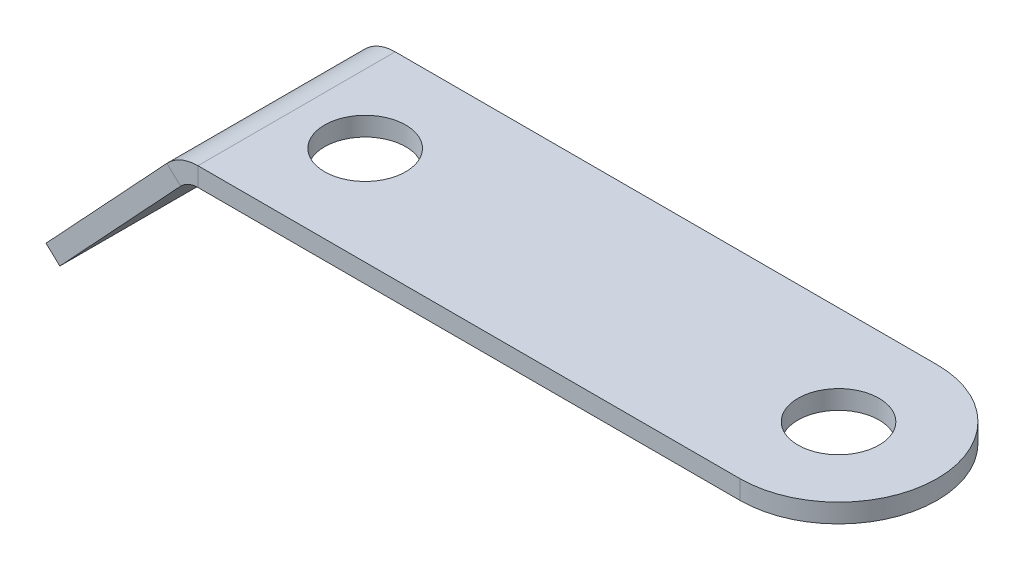
ISO-10303-21;
HEADER;
FILE_DESCRIPTION(('STEP AP214'),'2;1');
FILE_NAME('part.step','',(''),(''),'','','');
FILE_SCHEMA(('AUTOMOTIVE_DESIGN { 1 0 10303 214 1 1 1 1 }'));
ENDSEC;
DATA;
#1=APPLICATION_CONTEXT('core data for automotive mechanical design processes');
#2=APPLICATION_PROTOCOL_DEFINITION('international standard','automotive_design',2000,#1);
#3=PRODUCT_CONTEXT('',#1,'mechanical');
#4=PRODUCT('Part','Part','',(#3));
#5=PRODUCT_RELATED_PRODUCT_CATEGORY('part','',(#4));
#6=PRODUCT_DEFINITION_FORMATION('','',#4);
#7=PRODUCT_DEFINITION_CONTEXT('part definition',#1,'design');
#8=PRODUCT_DEFINITION('design','',#6,#7);
#9=PRODUCT_DEFINITION_SHAPE('','',#8);
#10=(LENGTH_UNIT() NAMED_UNIT(*) SI_UNIT(.MILLI.,.METRE.));
#11=(NAMED_UNIT(*) PLANE_ANGLE_UNIT() SI_UNIT($,.RADIAN.));
#12=(NAMED_UNIT(*) SI_UNIT($,.STERADIAN.) SOLID_ANGLE_UNIT());
#13=UNCERTAINTY_MEASURE_WITH_UNIT(LENGTH_MEASURE(1.E-05),#10,'distance_accuracy_value','');
#14=(GEOMETRIC_REPRESENTATION_CONTEXT(3) GLOBAL_UNCERTAINTY_ASSIGNED_CONTEXT((#13)) GLOBAL_UNIT_ASSIGNED_CONTEXT((#10,
#11,#12)) REPRESENTATION_CONTEXT('',''));
#15=CARTESIAN_POINT('',(0.,0.,0.));
#16=DIRECTION('',(0.,0.,1.));
#17=DIRECTION('',(1.,0.,0.));
#18=AXIS2_PLACEMENT_3D('',#15,#16,#17);
#19=CARTESIAN_POINT('',(0.,-1.51892,-15.875));
#20=DIRECTION('',(0.,0.,-1.));
#21=DIRECTION('',(-1.,0.,0.));
#22=AXIS2_PLACEMENT_3D('',#19,#20,#21);
#23=PLANE('',#22);
#24=DIRECTION('',(-1.,0.,0.));
#25=VECTOR('',#24,1.);
#26=CARTESIAN_POINT('',(0.,-1.51892,-15.875));
#27=LINE('',#26,#25);
#28=CARTESIAN_POINT('',(44.45,-1.51892,-15.875));
#29=VERTEX_POINT('',#28);
#30=CARTESIAN_POINT('',(0.828317574300574,-1.51892,-15.875));
#31=VERTEX_POINT('',#30);
#32=EDGE_CURVE('E190',#29,#31,#27,.T.);
#33=ORIENTED_EDGE('',*,*,#32,.T.);
#34=DIRECTION('',(0.,1.,0.));
#35=VECTOR('',#34,1.);
#36=CARTESIAN_POINT('',(0.828317574300573,-1.51892,-15.875));
#37=LINE('',#36,#35);
#38=CARTESIAN_POINT('',(0.828317574300573,0.,-15.875));
#39=VERTEX_POINT('',#38);
#40=EDGE_CURVE('E163',#31,#39,#37,.T.);
#41=ORIENTED_EDGE('',*,*,#40,.T.);
#42=DIRECTION('',(-1.,0.,0.));
#43=VECTOR('',#42,1.);
#44=CARTESIAN_POINT('',(0.,0.,-15.875));
#45=LINE('',#44,#43);
#46=CARTESIAN_POINT('',(44.45,0.,-15.875));
#47=VERTEX_POINT('',#46);
#48=EDGE_CURVE('E187',#47,#39,#45,.T.);
#49=ORIENTED_EDGE('',*,*,#48,.F.);
#50=DIRECTION('',(0.,1.,0.));
#51=VECTOR('',#50,1.);
#52=CARTESIAN_POINT('',(44.45,-1.51892,-15.875));
#53=LINE('',#52,#51);
#54=EDGE_CURVE('E11',#29,#47,#53,.T.);
#55=ORIENTED_EDGE('',*,*,#54,.F.);
#56=EDGE_LOOP('',(#33,#41,#49,#55));
#57=FACE_BOUND('',#56,.T.);
#58=ADVANCED_FACE('F43',(#57),#23,.T.);
#59=CARTESIAN_POINT('',(44.45,-1.51892,-7.9375));
#60=DIRECTION('',(0.,-1.,0.));
#61=DIRECTION('',(0.,0.,-1.));
#62=AXIS2_PLACEMENT_3D('',#59,#60,#61);
#63=PLANE('',#62);
#64=CARTESIAN_POINT('',(6.34999999999999,-1.51892,-7.9375));
#65=DIRECTION('',(0.,1.,0.));
#66=DIRECTION('',(0.,0.,1.));
#67=AXIS2_PLACEMENT_3D('',#64,#65,#66);
#68=CIRCLE('',#67,3.2639);
#69=CARTESIAN_POINT('',(6.34999999999999,-1.51892,-4.6736));
#70=VERTEX_POINT('',#69);
#71=EDGE_CURVE('E172',#70,#70,#68,.T.);
#72=ORIENTED_EDGE('',*,*,#71,.T.);
#73=EDGE_LOOP('',(#72));
#74=FACE_BOUND('',#73,.T.);
#75=CARTESIAN_POINT('',(44.45,-1.51892,-7.9375));
#76=DIRECTION('',(0.,1.,0.));
#77=DIRECTION('',(0.,0.,1.));
#78=AXIS2_PLACEMENT_3D('',#75,#76,#77);
#79=CIRCLE('',#78,3.2639);
#80=CARTESIAN_POINT('',(44.45,-1.51892,-4.6736));
#81=VERTEX_POINT('',#80);
#82=EDGE_CURVE('E178',#81,#81,#79,.T.);
#83=ORIENTED_EDGE('',*,*,#82,.T.);
#84=EDGE_LOOP('',(#83));
#85=FACE_BOUND('',#84,.T.);
#86=DIRECTION('',(1.,0.,0.));
#87=VECTOR('',#86,1.);
#88=CARTESIAN_POINT('',(0.,-1.51892,0.));
#89=LINE('',#88,#87);
#90=CARTESIAN_POINT('',(0.828317574300574,-1.51892,0.));
#91=VERTEX_POINT('',#90);
#92=CARTESIAN_POINT('',(44.45,-1.51892,0.));
#93=VERTEX_POINT('',#92);
#94=EDGE_CURVE('E184',#91,#93,#89,.T.);
#95=ORIENTED_EDGE('',*,*,#94,.F.);
#96=DIRECTION('',(0.,0.,-1.));
#97=VECTOR('',#96,1.);
#98=CARTESIAN_POINT('',(0.828317574300573,-1.51892,-15.875));
#99=LINE('',#98,#97);
#100=EDGE_CURVE('E65',#31,#91,#99,.F.);
#101=ORIENTED_EDGE('',*,*,#100,.F.);
#102=ORIENTED_EDGE('',*,*,#32,.F.);
#103=CARTESIAN_POINT('',(44.45,-1.51892,-7.9375));
#104=DIRECTION('',(0.,1.,0.));
#105=DIRECTION('',(0.,0.,-1.));
#106=AXIS2_PLACEMENT_3D('',#103,#104,#105);
#107=CIRCLE('',#106,7.9375);
#108=EDGE_CURVE('E186',#93,#29,#107,.T.);
#109=ORIENTED_EDGE('',*,*,#108,.F.);
#110=EDGE_LOOP('',(#95,#101,#102,#109));
#111=FACE_BOUND('',#110,.T.);
#112=ADVANCED_FACE('F229',(#74,#85,#111),#63,.T.);
#113=CARTESIAN_POINT('',(44.45,0.,-7.9375));
#114=DIRECTION('',(0.,-1.,0.));
#115=DIRECTION('',(0.,0.,-1.));
#116=AXIS2_PLACEMENT_3D('',#113,#114,#115);
#117=PLANE('',#116);
#118=CARTESIAN_POINT('',(44.45,0.,-7.9375));
#119=DIRECTION('',(0.,1.,0.));
#120=DIRECTION('',(0.,0.,1.));
#121=AXIS2_PLACEMENT_3D('',#118,#119,#120);
#122=CIRCLE('',#121,3.2639);
#123=CARTESIAN_POINT('',(44.45,0.,-4.6736));
#124=VERTEX_POINT('',#123);
#125=EDGE_CURVE('E175',#124,#124,#122,.T.);
#126=ORIENTED_EDGE('',*,*,#125,.F.);
#127=EDGE_LOOP('',(#126));
#128=FACE_BOUND('',#127,.T.);
#129=CARTESIAN_POINT('',(6.34999999999999,0.,-7.9375));
#130=DIRECTION('',(0.,1.,0.));
#131=DIRECTION('',(0.,0.,1.));
#132=AXIS2_PLACEMENT_3D('',#129,#130,#131);
#133=CIRCLE('',#132,3.2639);
#134=CARTESIAN_POINT('',(6.34999999999999,0.,-4.6736));
#135=VERTEX_POINT('',#134);
#136=EDGE_CURVE('E170',#135,#135,#133,.T.);
#137=ORIENTED_EDGE('',*,*,#136,.F.);
#138=EDGE_LOOP('',(#137));
#139=FACE_BOUND('',#138,.T.);
#140=DIRECTION('',(0.,0.,-1.));
#141=VECTOR('',#140,1.);
#142=CARTESIAN_POINT('',(0.828317574300573,0.,-15.875));
#143=LINE('',#142,#141);
#144=CARTESIAN_POINT('',(0.828317574300574,0.,0.));
#145=VERTEX_POINT('',#144);
#146=EDGE_CURVE('E116',#39,#145,#143,.F.);
#147=ORIENTED_EDGE('',*,*,#146,.T.);
#148=DIRECTION('',(1.,0.,0.));
#149=VECTOR('',#148,1.);
#150=CARTESIAN_POINT('',(0.,0.,0.));
#151=LINE('',#150,#149);
#152=CARTESIAN_POINT('',(44.45,0.,0.));
#153=VERTEX_POINT('',#152);
#154=EDGE_CURVE('E181',#145,#153,#151,.T.);
#155=ORIENTED_EDGE('',*,*,#154,.T.);
#156=CARTESIAN_POINT('',(44.45,0.,-7.9375));
#157=DIRECTION('',(0.,1.,0.));
#158=DIRECTION('',(0.,0.,-1.));
#159=AXIS2_PLACEMENT_3D('',#156,#157,#158);
#160=CIRCLE('',#159,7.9375);
#161=EDGE_CURVE('E193',#153,#47,#160,.T.);
#162=ORIENTED_EDGE('',*,*,#161,.T.);
#163=ORIENTED_EDGE('',*,*,#48,.T.);
#164=EDGE_LOOP('',(#147,#155,#162,#163));
#165=FACE_BOUND('',#164,.T.);
#166=ADVANCED_FACE('F199',(#128,#139,#165),#117,.F.);
#167=CARTESIAN_POINT('',(44.45,-1.51892,-7.9375));
#168=DIRECTION('',(0.,1.,0.));
#169=DIRECTION('',(0.,0.,1.));
#170=AXIS2_PLACEMENT_3D('',#167,#168,#169);
#171=CYLINDRICAL_SURFACE('',#170,7.9375);
#172=ORIENTED_EDGE('',*,*,#161,.F.);
#173=DIRECTION('',(0.,1.,0.));
#174=VECTOR('',#173,1.);
#175=CARTESIAN_POINT('',(44.45,-1.51892,0.));
#176=LINE('',#175,#174);
#177=EDGE_CURVE('E47',#93,#153,#176,.T.);
#178=ORIENTED_EDGE('',*,*,#177,.F.);
#179=ORIENTED_EDGE('',*,*,#108,.T.);
#180=ORIENTED_EDGE('',*,*,#54,.T.);
#181=EDGE_LOOP('',(#172,#178,#179,#180));
#182=FACE_BOUND('',#181,.T.);
#183=ADVANCED_FACE('F237',(#182),#171,.T.);
#184=CARTESIAN_POINT('',(0.,-1.51892,0.));
#185=DIRECTION('',(0.,0.,1.));
#186=DIRECTION('',(1.,0.,0.));
#187=AXIS2_PLACEMENT_3D('',#184,#185,#186);
#188=PLANE('',#187);
#189=DIRECTION('',(0.,1.,0.));
#190=VECTOR('',#189,1.);
#191=CARTESIAN_POINT('',(0.828317574300573,-1.51892,0.));
#192=LINE('',#191,#190);
#193=EDGE_CURVE('E58',#91,#145,#192,.T.);
#194=ORIENTED_EDGE('',*,*,#193,.F.);
#195=ORIENTED_EDGE('',*,*,#94,.T.);
#196=ORIENTED_EDGE('',*,*,#177,.T.);
#197=ORIENTED_EDGE('',*,*,#154,.F.);
#198=EDGE_LOOP('',(#194,#195,#196,#197));
#199=FACE_BOUND('',#198,.T.);
#200=ADVANCED_FACE('F45',(#199),#188,.T.);
#201=CARTESIAN_POINT('',(44.45,-1.51892,-7.9375));
#202=DIRECTION('',(0.,1.,0.));
#203=DIRECTION('',(0.,0.,1.));
#204=AXIS2_PLACEMENT_3D('',#201,#202,#203);
#205=CYLINDRICAL_SURFACE('',#204,3.2639);
#206=ORIENTED_EDGE('',*,*,#82,.F.);
#207=EDGE_LOOP('',(#206));
#208=FACE_BOUND('',#207,.T.);
#209=ORIENTED_EDGE('',*,*,#125,.T.);
#210=EDGE_LOOP('',(#209));
#211=FACE_BOUND('',#210,.T.);
#212=ADVANCED_FACE('F224',(#208,#211),#205,.F.);
#213=CARTESIAN_POINT('',(6.34999999999999,-1.51892,-7.9375));
#214=DIRECTION('',(0.,1.,0.));
#215=DIRECTION('',(0.,0.,1.));
#216=AXIS2_PLACEMENT_3D('',#213,#214,#215);
#217=CYLINDRICAL_SURFACE('',#216,3.2639);
#218=ORIENTED_EDGE('',*,*,#71,.F.);
#219=EDGE_LOOP('',(#218));
#220=FACE_BOUND('',#219,.T.);
#221=ORIENTED_EDGE('',*,*,#136,.T.);
#222=EDGE_LOOP('',(#221));
#223=FACE_BOUND('',#222,.T.);
#224=ADVANCED_FACE('F216',(#220,#223),#217,.F.);
#225=CARTESIAN_POINT('',(0.828317574300573,-3.42392,0.));
#226=DIRECTION('',(0.,0.,1.));
#227=DIRECTION('',(1.,0.,0.));
#228=AXIS2_PLACEMENT_3D('',#225,#226,#227);
#229=PLANE('',#228);
#230=DIRECTION('',(-0.731353701619167,0.681998360062502,0.));
#231=VECTOR('',#230,1.);
#232=CARTESIAN_POINT('',(-0.56491122728394,-2.12471312408093,0.));
#233=LINE('',#232,#231);
#234=CARTESIAN_POINT('',(-0.564911227283941,-2.12471312408093,0.));
#235=VERTEX_POINT('',#234);
#236=CARTESIAN_POINT('',(-1.67577899174733,-1.0888121750148,0.));
#237=VERTEX_POINT('',#236);
#238=EDGE_CURVE('E208',#235,#237,#233,.T.);
#239=ORIENTED_EDGE('',*,*,#238,.F.);
#240=CARTESIAN_POINT('',(0.828317574300573,-3.42392,0.));
#241=DIRECTION('',(0.,0.,-1.));
#242=DIRECTION('',(-1.,0.,0.));
#243=AXIS2_PLACEMENT_3D('',#240,#241,#242);
#244=CIRCLE('',#243,1.905);
#245=EDGE_CURVE('E119',#91,#235,#244,.F.);
#246=ORIENTED_EDGE('',*,*,#245,.F.);
#247=ORIENTED_EDGE('',*,*,#193,.T.);
#248=CARTESIAN_POINT('',(0.828317574300573,-3.42392,0.));
#249=DIRECTION('',(0.,0.,-1.));
#250=DIRECTION('',(-1.,0.,0.));
#251=AXIS2_PLACEMENT_3D('',#248,#249,#250);
#252=CIRCLE('',#251,3.42392);
#253=EDGE_CURVE('E162',#145,#237,#252,.F.);
#254=ORIENTED_EDGE('',*,*,#253,.T.);
#255=EDGE_LOOP('',(#239,#246,#247,#254));
#256=FACE_BOUND('',#255,.T.);
#257=ADVANCED_FACE('F214',(#256),#229,.T.);
#258=CARTESIAN_POINT('',(0.828317574300573,-3.42392,-15.875));
#259=DIRECTION('',(0.,0.,1.));
#260=DIRECTION('',(1.,0.,0.));
#261=AXIS2_PLACEMENT_3D('',#258,#259,#260);
#262=PLANE('',#261);
#263=CARTESIAN_POINT('',(0.828317574300573,-3.42392,-15.875));
#264=DIRECTION('',(0.,0.,-1.));
#265=DIRECTION('',(-1.,0.,0.));
#266=AXIS2_PLACEMENT_3D('',#263,#264,#265);
#267=CIRCLE('',#266,1.905);
#268=CARTESIAN_POINT('',(-0.564911227283941,-2.12471312408093,-15.875));
#269=VERTEX_POINT('',#268);
#270=EDGE_CURVE('E126',#269,#31,#267,.T.);
#271=ORIENTED_EDGE('',*,*,#270,.F.);
#272=DIRECTION('',(-0.731353701619167,0.681998360062502,0.));
#273=VECTOR('',#272,1.);
#274=CARTESIAN_POINT('',(-0.56491122728394,-2.12471312408093,-15.875));
#275=LINE('',#274,#273);
#276=CARTESIAN_POINT('',(-1.67577899174733,-1.0888121750148,-15.875));
#277=VERTEX_POINT('',#276);
#278=EDGE_CURVE('E123',#269,#277,#275,.T.);
#279=ORIENTED_EDGE('',*,*,#278,.T.);
#280=CARTESIAN_POINT('',(0.828317574300573,-3.42392,-15.875));
#281=DIRECTION('',(0.,0.,-1.));
#282=DIRECTION('',(-1.,0.,0.));
#283=AXIS2_PLACEMENT_3D('',#280,#281,#282);
#284=CIRCLE('',#283,3.42392);
#285=EDGE_CURVE('E109',#277,#39,#284,.T.);
#286=ORIENTED_EDGE('',*,*,#285,.T.);
#287=ORIENTED_EDGE('',*,*,#40,.F.);
#288=EDGE_LOOP('',(#271,#279,#286,#287));
#289=FACE_BOUND('',#288,.T.);
#290=ADVANCED_FACE('F124',(#289),#262,.F.);
#291=CARTESIAN_POINT('',(0.828317574300573,-3.42392,-15.875));
#292=DIRECTION('',(0.,0.,-1.));
#293=DIRECTION('',(-0.731353701619167,0.681998360062502,0.));
#294=AXIS2_PLACEMENT_3D('',#291,#292,#293);
#295=CYLINDRICAL_SURFACE('',#294,3.42392);
#296=ORIENTED_EDGE('',*,*,#146,.F.);
#297=ORIENTED_EDGE('',*,*,#285,.F.);
#298=DIRECTION('',(0.,0.,1.));
#299=VECTOR('',#298,1.);
#300=CARTESIAN_POINT('',(-1.67577899174733,-1.0888121750148,0.));
#301=LINE('',#300,#299);
#302=EDGE_CURVE('E114',#277,#237,#301,.T.);
#303=ORIENTED_EDGE('',*,*,#302,.T.);
#304=ORIENTED_EDGE('',*,*,#253,.F.);
#305=EDGE_LOOP('',(#296,#297,#303,#304));
#306=FACE_BOUND('',#305,.T.);
#307=ADVANCED_FACE('F111',(#306),#295,.T.);
#308=CARTESIAN_POINT('',(0.828317574300573,-3.42392,-15.875));
#309=DIRECTION('',(0.,0.,-1.));
#310=DIRECTION('',(-0.731353701619167,0.681998360062502,0.));
#311=AXIS2_PLACEMENT_3D('',#308,#309,#310);
#312=CYLINDRICAL_SURFACE('',#311,1.905);
#313=ORIENTED_EDGE('',*,*,#100,.T.);
#314=ORIENTED_EDGE('',*,*,#245,.T.);
#315=DIRECTION('',(0.,0.,-1.));
#316=VECTOR('',#315,1.);
#317=CARTESIAN_POINT('',(-0.56491122728394,-2.12471312408093,0.));
#318=LINE('',#317,#316);
#319=EDGE_CURVE('E130',#235,#269,#318,.T.);
#320=ORIENTED_EDGE('',*,*,#319,.T.);
#321=ORIENTED_EDGE('',*,*,#270,.T.);
#322=EDGE_LOOP('',(#313,#314,#320,#321));
#323=FACE_BOUND('',#322,.T.);
#324=ADVANCED_FACE('F203',(#323),#312,.F.);
#325=CARTESIAN_POINT('',(-11.4005553868399,-11.5173580930986,-15.875));
#326=DIRECTION('',(0.,0.,1.));
#327=DIRECTION('',(1.,0.,0.));
#328=AXIS2_PLACEMENT_3D('',#325,#326,#327);
#329=PLANE('',#328);
#330=ORIENTED_EDGE('',*,*,#278,.F.);
#331=DIRECTION('',(-0.681998360062502,-0.731353701619167,0.));
#332=VECTOR('',#331,1.);
#333=CARTESIAN_POINT('',(-10.2896876223766,-12.5532590421648,-15.875));
#334=LINE('',#333,#332);
#335=CARTESIAN_POINT('',(-10.2896876223766,-12.5532590421648,-15.875));
#336=VERTEX_POINT('',#335);
#337=EDGE_CURVE('E139',#269,#336,#334,.T.);
#338=ORIENTED_EDGE('',*,*,#337,.T.);
#339=DIRECTION('',(0.731353701619167,-0.681998360062502,0.));
#340=VECTOR('',#339,1.);
#341=CARTESIAN_POINT('',(-11.4005553868399,-11.5173580930986,-15.875));
#342=LINE('',#341,#340);
#343=CARTESIAN_POINT('',(-11.4005553868399,-11.5173580930986,-15.875));
#344=VERTEX_POINT('',#343);
#345=EDGE_CURVE('E143',#344,#336,#342,.T.);
#346=ORIENTED_EDGE('',*,*,#345,.F.);
#347=DIRECTION('',(-0.681998360062502,-0.731353701619167,0.));
#348=VECTOR('',#347,1.);
#349=CARTESIAN_POINT('',(-11.4005553868399,-11.5173580930986,-15.875));
#350=LINE('',#349,#348);
#351=EDGE_CURVE('E135',#277,#344,#350,.T.);
#352=ORIENTED_EDGE('',*,*,#351,.F.);
#353=EDGE_LOOP('',(#330,#338,#346,#352));
#354=FACE_BOUND('',#353,.T.);
#355=ADVANCED_FACE('F141',(#354),#329,.F.);
#356=CARTESIAN_POINT('',(-1.11086776446339,-0.483019050933865,0.));
#357=DIRECTION('',(0.,0.,-1.));
#358=DIRECTION('',(-1.,0.,0.));
#359=AXIS2_PLACEMENT_3D('',#356,#357,#358);
#360=PLANE('',#359);
#361=ORIENTED_EDGE('',*,*,#238,.T.);
#362=DIRECTION('',(0.681998360062502,0.731353701619167,0.));
#363=VECTOR('',#362,1.);
#364=CARTESIAN_POINT('',(-1.11086776446339,-0.483019050933865,0.));
#365=LINE('',#364,#363);
#366=CARTESIAN_POINT('',(-11.4005553868399,-11.5173580930986,0.));
#367=VERTEX_POINT('',#366);
#368=EDGE_CURVE('E138',#367,#237,#365,.T.);
#369=ORIENTED_EDGE('',*,*,#368,.F.);
#370=DIRECTION('',(0.731353701619167,-0.681998360062502,0.));
#371=VECTOR('',#370,1.);
#372=CARTESIAN_POINT('',(-11.4005553868399,-11.5173580930986,0.));
#373=LINE('',#372,#371);
#374=CARTESIAN_POINT('',(-10.2896876223766,-12.5532590421648,0.));
#375=VERTEX_POINT('',#374);
#376=EDGE_CURVE('E155',#367,#375,#373,.T.);
#377=ORIENTED_EDGE('',*,*,#376,.T.);
#378=DIRECTION('',(0.681998360062502,0.731353701619167,0.));
#379=VECTOR('',#378,1.);
#380=CARTESIAN_POINT('',(0.,-1.51892,0.));
#381=LINE('',#380,#379);
#382=EDGE_CURVE('E146',#375,#235,#381,.T.);
#383=ORIENTED_EDGE('',*,*,#382,.T.);
#384=EDGE_LOOP('',(#361,#369,#377,#383));
#385=FACE_BOUND('',#384,.T.);
#386=ADVANCED_FACE('F212',(#385),#360,.F.);
#387=CARTESIAN_POINT('',(-0.353257770853059,0.329418200615842,0.));
#388=DIRECTION('',(0.731353701619167,-0.681998360062502,0.));
#389=DIRECTION('',(0.681998360062502,0.731353701619167,0.));
#390=AXIS2_PLACEMENT_3D('',#387,#388,#389);
#391=PLANE('',#390);
#392=ORIENTED_EDGE('',*,*,#302,.F.);
#393=ORIENTED_EDGE('',*,*,#351,.T.);
#394=DIRECTION('',(0.,0.,1.));
#395=VECTOR('',#394,1.);
#396=CARTESIAN_POINT('',(-11.4005553868399,-11.5173580930986,0.));
#397=LINE('',#396,#395);
#398=EDGE_CURVE('E145',#344,#367,#397,.T.);
#399=ORIENTED_EDGE('',*,*,#398,.T.);
#400=ORIENTED_EDGE('',*,*,#368,.T.);
#401=EDGE_LOOP('',(#392,#393,#399,#400));
#402=FACE_BOUND('',#401,.T.);
#403=ADVANCED_FACE('F134',(#402),#391,.F.);
#404=CARTESIAN_POINT('',(0.757609993610327,-0.706482748450294,0.));
#405=DIRECTION('',(0.731353701619167,-0.681998360062502,0.));
#406=DIRECTION('',(0.681998360062502,0.731353701619167,0.));
#407=AXIS2_PLACEMENT_3D('',#404,#405,#406);
#408=PLANE('',#407);
#409=ORIENTED_EDGE('',*,*,#337,.F.);
#410=ORIENTED_EDGE('',*,*,#319,.F.);
#411=ORIENTED_EDGE('',*,*,#382,.F.);
#412=DIRECTION('',(0.,0.,1.));
#413=VECTOR('',#412,1.);
#414=CARTESIAN_POINT('',(-10.2896876223766,-12.5532590421648,0.));
#415=LINE('',#414,#413);
#416=EDGE_CURVE('E150',#336,#375,#415,.T.);
#417=ORIENTED_EDGE('',*,*,#416,.F.);
#418=EDGE_LOOP('',(#409,#410,#411,#417));
#419=FACE_BOUND('',#418,.T.);
#420=ADVANCED_FACE('F341',(#419),#408,.T.);
#421=CARTESIAN_POINT('',(-11.4005553868399,-11.5173580930986,0.));
#422=DIRECTION('',(0.681998360062502,0.731353701619167,0.));
#423=DIRECTION('',(-0.731353701619167,0.681998360062502,0.));
#424=AXIS2_PLACEMENT_3D('',#421,#422,#423);
#425=PLANE('',#424);
#426=ORIENTED_EDGE('',*,*,#416,.T.);
#427=ORIENTED_EDGE('',*,*,#376,.F.);
#428=ORIENTED_EDGE('',*,*,#398,.F.);
#429=ORIENTED_EDGE('',*,*,#345,.T.);
#430=EDGE_LOOP('',(#426,#427,#428,#429));
#431=FACE_BOUND('',#430,.T.);
#432=ADVANCED_FACE('F351',(#431),#425,.F.);
#433=CLOSED_SHELL('',(#58,#112,#166,#183,#200,#212,#224,#257,#290,#307,#324,#355,#386,#403,#420,#432));
#434=MANIFOLD_SOLID_BREP('B2',#433);
#435=ADVANCED_BREP_SHAPE_REPRESENTATION('',(#18,#434),#14);
#436=SHAPE_DEFINITION_REPRESENTATION(#9,#435);
ENDSEC;
END-ISO-10303-21;
